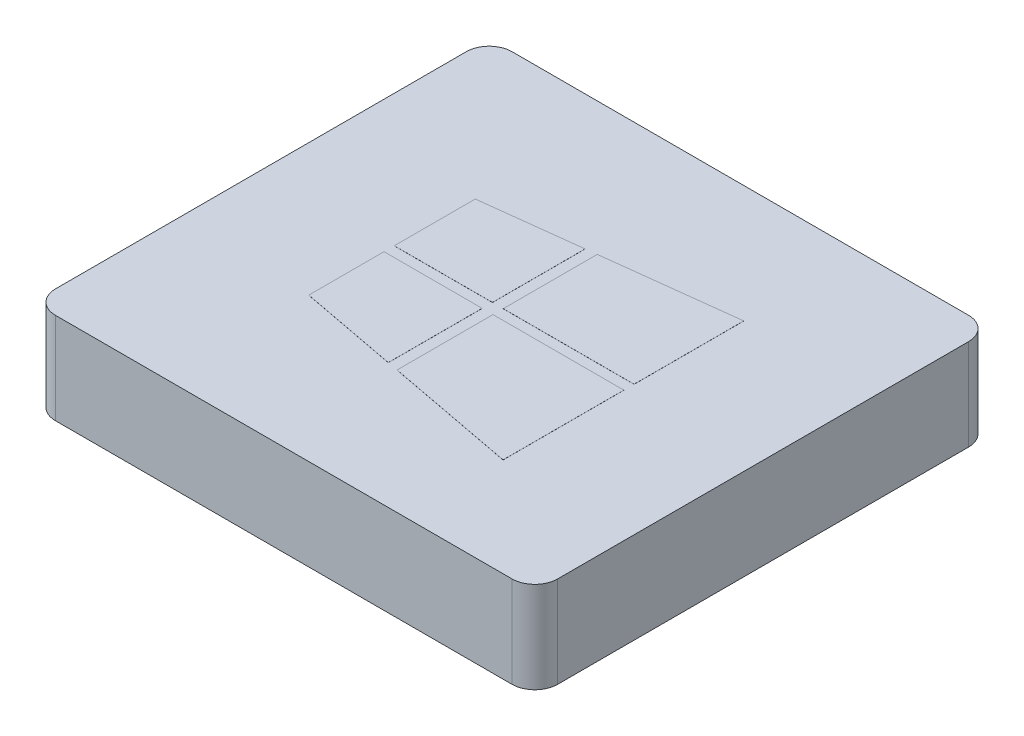
ISO-10303-21;
HEADER;
FILE_DESCRIPTION(('STEP AP214'),'2;1');
FILE_NAME('part.step','',(''),(''),'','','');
FILE_SCHEMA(('AUTOMOTIVE_DESIGN { 1 0 10303 214 1 1 1 1 }'));
ENDSEC;
DATA;
#1=APPLICATION_CONTEXT('core data for automotive mechanical design processes');
#2=APPLICATION_PROTOCOL_DEFINITION('international standard','automotive_design',2000,#1);
#3=PRODUCT_CONTEXT('',#1,'mechanical');
#4=PRODUCT('Part','Part','',(#3));
#5=PRODUCT_RELATED_PRODUCT_CATEGORY('part','',(#4));
#6=PRODUCT_DEFINITION_FORMATION('','',#4);
#7=PRODUCT_DEFINITION_CONTEXT('part definition',#1,'design');
#8=PRODUCT_DEFINITION('design','',#6,#7);
#9=PRODUCT_DEFINITION_SHAPE('','',#8);
#10=(LENGTH_UNIT() NAMED_UNIT(*) SI_UNIT(.MILLI.,.METRE.));
#11=(NAMED_UNIT(*) PLANE_ANGLE_UNIT() SI_UNIT($,.RADIAN.));
#12=(NAMED_UNIT(*) SI_UNIT($,.STERADIAN.) SOLID_ANGLE_UNIT());
#13=UNCERTAINTY_MEASURE_WITH_UNIT(LENGTH_MEASURE(1.E-05),#10,'distance_accuracy_value','');
#14=(GEOMETRIC_REPRESENTATION_CONTEXT(3) GLOBAL_UNCERTAINTY_ASSIGNED_CONTEXT((#13)) GLOBAL_UNIT_ASSIGNED_CONTEXT((#10,
#11,#12)) REPRESENTATION_CONTEXT('',''));
#15=CARTESIAN_POINT('',(0.,0.,0.));
#16=DIRECTION('',(0.,0.,1.));
#17=DIRECTION('',(1.,0.,0.));
#18=AXIS2_PLACEMENT_3D('',#15,#16,#17);
#19=CARTESIAN_POINT('',(0.,2.54,0.));
#20=DIRECTION('',(0.,1.,0.));
#21=DIRECTION('',(0.,0.,1.));
#22=AXIS2_PLACEMENT_3D('',#19,#20,#21);
#23=PLANE('',#22);
#24=DIRECTION('',(-1.,0.,0.));
#25=VECTOR('',#24,1.);
#26=CARTESIAN_POINT('',(13.97,2.54,-12.7));
#27=LINE('',#26,#25);
#28=CARTESIAN_POINT('',(13.335,2.54,-12.7));
#29=VERTEX_POINT('',#28);
#30=CARTESIAN_POINT('',(0.634999999999995,2.54,-12.7));
#31=VERTEX_POINT('',#30);
#32=EDGE_CURVE('E385',#29,#31,#27,.T.);
#33=ORIENTED_EDGE('',*,*,#32,.T.);
#34=CARTESIAN_POINT('',(0.634999999999995,2.54,-12.065));
#35=DIRECTION('',(0.,1.,0.));
#36=DIRECTION('',(0.,0.,1.));
#37=AXIS2_PLACEMENT_3D('',#34,#35,#36);
#38=CIRCLE('',#37,0.635);
#39=CARTESIAN_POINT('',(0.,2.54,-12.065));
#40=VERTEX_POINT('',#39);
#41=EDGE_CURVE('E422',#31,#40,#38,.T.);
#42=ORIENTED_EDGE('',*,*,#41,.T.);
#43=DIRECTION('',(0.,0.,1.));
#44=VECTOR('',#43,1.);
#45=CARTESIAN_POINT('',(0.,2.54,-12.7));
#46=LINE('',#45,#44);
#47=CARTESIAN_POINT('',(0.,2.54,-0.635));
#48=VERTEX_POINT('',#47);
#49=EDGE_CURVE('E375',#40,#48,#46,.T.);
#50=ORIENTED_EDGE('',*,*,#49,.T.);
#51=CARTESIAN_POINT('',(0.635,2.54,-0.635));
#52=DIRECTION('',(0.,1.,0.));
#53=DIRECTION('',(0.,0.,1.));
#54=AXIS2_PLACEMENT_3D('',#51,#52,#53);
#55=CIRCLE('',#54,0.635);
#56=CARTESIAN_POINT('',(0.635,2.54,0.));
#57=VERTEX_POINT('',#56);
#58=EDGE_CURVE('E416',#48,#57,#55,.T.);
#59=ORIENTED_EDGE('',*,*,#58,.T.);
#60=DIRECTION('',(1.,0.,0.));
#61=VECTOR('',#60,1.);
#62=CARTESIAN_POINT('',(0.,2.54,0.));
#63=LINE('',#62,#61);
#64=CARTESIAN_POINT('',(13.335,2.54,0.));
#65=VERTEX_POINT('',#64);
#66=EDGE_CURVE('E378',#57,#65,#63,.T.);
#67=ORIENTED_EDGE('',*,*,#66,.T.);
#68=CARTESIAN_POINT('',(13.335,2.54,-0.635));
#69=DIRECTION('',(0.,1.,0.));
#70=DIRECTION('',(0.,0.,1.));
#71=AXIS2_PLACEMENT_3D('',#68,#69,#70);
#72=CIRCLE('',#71,0.635);
#73=CARTESIAN_POINT('',(13.97,2.54,-0.635));
#74=VERTEX_POINT('',#73);
#75=EDGE_CURVE('E418',#65,#74,#72,.T.);
#76=ORIENTED_EDGE('',*,*,#75,.T.);
#77=DIRECTION('',(0.,0.,-1.));
#78=VECTOR('',#77,1.);
#79=CARTESIAN_POINT('',(13.97,2.54,0.));
#80=LINE('',#79,#78);
#81=CARTESIAN_POINT('',(13.97,2.54,-12.065));
#82=VERTEX_POINT('',#81);
#83=EDGE_CURVE('E382',#74,#82,#80,.T.);
#84=ORIENTED_EDGE('',*,*,#83,.T.);
#85=CARTESIAN_POINT('',(13.335,2.54,-12.065));
#86=DIRECTION('',(0.,1.,0.));
#87=DIRECTION('',(0.,0.,1.));
#88=AXIS2_PLACEMENT_3D('',#85,#86,#87);
#89=CIRCLE('',#88,0.635);
#90=EDGE_CURVE('E420',#82,#29,#89,.T.);
#91=ORIENTED_EDGE('',*,*,#90,.T.);
#92=EDGE_LOOP('',(#33,#42,#50,#59,#67,#76,#84,#91));
#93=FACE_BOUND('',#92,.T.);
#94=DIRECTION('',(1.,0.,0.));
#95=VECTOR('',#94,1.);
#96=CARTESIAN_POINT('',(6.40577196412417,2.54,-6.38504060141719));
#97=LINE('',#96,#95);
#98=CARTESIAN_POINT('',(3.67579997060656,2.54,-6.38504060141719));
#99=VERTEX_POINT('',#98);
#100=CARTESIAN_POINT('',(6.40577196412417,2.54,-6.38504060141719));
#101=VERTEX_POINT('',#100);
#102=EDGE_CURVE('E320',#99,#101,#97,.T.);
#103=ORIENTED_EDGE('',*,*,#102,.F.);
#104=DIRECTION('',(0.,0.,1.));
#105=VECTOR('',#104,1.);
#106=CARTESIAN_POINT('',(3.67579997060656,2.54,-6.38504060141719));
#107=LINE('',#106,#105);
#108=CARTESIAN_POINT('',(3.67579997060656,2.54,-8.6368819068046));
#109=VERTEX_POINT('',#108);
#110=EDGE_CURVE('E306',#109,#99,#107,.T.);
#111=ORIENTED_EDGE('',*,*,#110,.F.);
#112=DIRECTION('',(-0.992924579188595,0.,0.118746705399144));
#113=VECTOR('',#112,1.);
#114=CARTESIAN_POINT('',(3.67579997060656,2.54,-8.6368819068046));
#115=LINE('',#114,#113);
#116=CARTESIAN_POINT('',(6.40577196412417,2.54,-8.96336710704716));
#117=VERTEX_POINT('',#116);
#118=EDGE_CURVE('E311',#117,#109,#115,.T.);
#119=ORIENTED_EDGE('',*,*,#118,.F.);
#120=DIRECTION('',(0.,0.,-1.));
#121=VECTOR('',#120,1.);
#122=CARTESIAN_POINT('',(6.40577196412417,2.54,-8.96336710704716));
#123=LINE('',#122,#121);
#124=EDGE_CURVE('E322',#101,#117,#123,.T.);
#125=ORIENTED_EDGE('',*,*,#124,.F.);
#126=EDGE_LOOP('',(#103,#111,#119,#125));
#127=FACE_BOUND('',#126,.T.);
#128=DIRECTION('',(0.,0.,1.));
#129=VECTOR('',#128,1.);
#130=CARTESIAN_POINT('',(3.67579997060656,2.54,-6.09970454559755));
#131=LINE('',#130,#129);
#132=CARTESIAN_POINT('',(3.67579997060656,2.54,-6.09970454559755));
#133=VERTEX_POINT('',#132);
#134=CARTESIAN_POINT('',(3.67579997060656,2.54,-4.00661172831581));
#135=VERTEX_POINT('',#134);
#136=EDGE_CURVE('E291',#133,#135,#131,.T.);
#137=ORIENTED_EDGE('',*,*,#136,.F.);
#138=DIRECTION('',(-1.,0.,0.));
#139=VECTOR('',#138,1.);
#140=CARTESIAN_POINT('',(6.40577196412417,2.54,-6.09970454559755));
#141=LINE('',#140,#139);
#142=CARTESIAN_POINT('',(6.40577196412417,2.54,-6.09970454559755));
#143=VERTEX_POINT('',#142);
#144=EDGE_CURVE('E277',#143,#133,#141,.T.);
#145=ORIENTED_EDGE('',*,*,#144,.F.);
#146=DIRECTION('',(0.,0.,-1.));
#147=VECTOR('',#146,1.);
#148=CARTESIAN_POINT('',(6.40577196412417,2.54,-3.48850625137088));
#149=LINE('',#148,#147);
#150=CARTESIAN_POINT('',(6.40577196412417,2.54,-3.48850625137088));
#151=VERTEX_POINT('',#150);
#152=EDGE_CURVE('E282',#151,#143,#149,.T.);
#153=ORIENTED_EDGE('',*,*,#152,.F.);
#154=DIRECTION('',(0.982463314673955,0.,0.186455987621384));
#155=VECTOR('',#154,1.);
#156=CARTESIAN_POINT('',(3.67579997060656,2.54,-4.00661172831581));
#157=LINE('',#156,#155);
#158=EDGE_CURVE('E293',#135,#151,#157,.T.);
#159=ORIENTED_EDGE('',*,*,#158,.F.);
#160=EDGE_LOOP('',(#137,#145,#153,#159));
#161=FACE_BOUND('',#160,.T.);
#162=DIRECTION('',(0.,0.,1.));
#163=VECTOR('',#162,1.);
#164=CARTESIAN_POINT('',(6.70653159052866,2.54,-8.99933581554846));
#165=LINE('',#164,#163);
#166=CARTESIAN_POINT('',(6.70653159052866,2.54,-8.99933581554846));
#167=VERTEX_POINT('',#166);
#168=CARTESIAN_POINT('',(6.70653159052866,2.54,-6.38504060141719));
#169=VERTEX_POINT('',#168);
#170=EDGE_CURVE('E249',#167,#169,#165,.T.);
#171=ORIENTED_EDGE('',*,*,#170,.F.);
#172=DIRECTION('',(-0.992924579188595,0.,0.118746705399145));
#173=VECTOR('',#172,1.);
#174=CARTESIAN_POINT('',(10.3458469793895,2.54,-9.43457200709162));
#175=LINE('',#174,#173);
#176=CARTESIAN_POINT('',(10.3458469793895,2.54,-9.43457200709162));
#177=VERTEX_POINT('',#176);
#178=EDGE_CURVE('E246',#177,#167,#175,.T.);
#179=ORIENTED_EDGE('',*,*,#178,.F.);
#180=DIRECTION('',(0.,0.,-1.));
#181=VECTOR('',#180,1.);
#182=CARTESIAN_POINT('',(10.3458469793895,2.54,-6.38504060141719));
#183=LINE('',#182,#181);
#184=CARTESIAN_POINT('',(10.3458469793895,2.54,-6.38504060141719));
#185=VERTEX_POINT('',#184);
#186=EDGE_CURVE('E258',#185,#177,#183,.T.);
#187=ORIENTED_EDGE('',*,*,#186,.F.);
#188=DIRECTION('',(1.,0.,0.));
#189=VECTOR('',#188,1.);
#190=CARTESIAN_POINT('',(6.70653159052866,2.54,-6.38504060141719));
#191=LINE('',#190,#189);
#192=EDGE_CURVE('E266',#169,#185,#191,.T.);
#193=ORIENTED_EDGE('',*,*,#192,.F.);
#194=EDGE_LOOP('',(#171,#179,#187,#193));
#195=FACE_BOUND('',#194,.T.);
#196=DIRECTION('',(0.,0.,1.));
#197=VECTOR('',#196,1.);
#198=CARTESIAN_POINT('',(6.70653159052866,2.54,-6.09970454559755));
#199=LINE('',#198,#197);
#200=CARTESIAN_POINT('',(6.70653159052866,2.54,-6.09970454559755));
#201=VERTEX_POINT('',#200);
#202=CARTESIAN_POINT('',(6.70653159052866,2.54,-3.43142683441932));
#203=VERTEX_POINT('',#202);
#204=EDGE_CURVE('E798',#201,#203,#199,.T.);
#205=ORIENTED_EDGE('',*,*,#204,.F.);
#206=DIRECTION('',(-1.,0.,0.));
#207=VECTOR('',#206,1.);
#208=CARTESIAN_POINT('',(10.3458469793895,2.54,-6.09970454559755));
#209=LINE('',#208,#207);
#210=CARTESIAN_POINT('',(10.3458469793895,2.54,-6.09970454559755));
#211=VERTEX_POINT('',#210);
#212=EDGE_CURVE('E244',#211,#201,#209,.T.);
#213=ORIENTED_EDGE('',*,*,#212,.F.);
#214=DIRECTION('',(0.,0.,-1.));
#215=VECTOR('',#214,1.);
#216=CARTESIAN_POINT('',(10.3458469793895,2.54,-2.74074237326877));
#217=LINE('',#216,#215);
#218=CARTESIAN_POINT('',(10.3458469793895,2.54,-2.74074237326877));
#219=VERTEX_POINT('',#218);
#220=EDGE_CURVE('E240',#219,#211,#217,.T.);
#221=ORIENTED_EDGE('',*,*,#220,.F.);
#222=DIRECTION('',(0.982463314673955,0.,0.186455987621384));
#223=VECTOR('',#222,1.);
#224=CARTESIAN_POINT('',(6.70653159052866,2.54,-3.43142683441932));
#225=LINE('',#224,#223);
#226=EDGE_CURVE('E795',#203,#219,#225,.T.);
#227=ORIENTED_EDGE('',*,*,#226,.F.);
#228=EDGE_LOOP('',(#205,#213,#221,#227));
#229=FACE_BOUND('',#228,.T.);
#230=ADVANCED_FACE('F35',(#93,#127,#161,#195,#229),#23,.T.);
#231=CARTESIAN_POINT('',(0.,2.54,-12.7));
#232=DIRECTION('',(1.,0.,0.));
#233=DIRECTION('',(0.,0.,-1.));
#234=AXIS2_PLACEMENT_3D('',#231,#232,#233);
#235=PLANE('',#234);
#236=ORIENTED_EDGE('',*,*,#49,.F.);
#237=DIRECTION('',(0.,-1.,0.));
#238=VECTOR('',#237,1.);
#239=CARTESIAN_POINT('',(0.,2.54,-12.065));
#240=LINE('',#239,#238);
#241=CARTESIAN_POINT('',(0.,0.,-12.065));
#242=VERTEX_POINT('',#241);
#243=EDGE_CURVE('E400',#40,#242,#240,.T.);
#244=ORIENTED_EDGE('',*,*,#243,.T.);
#245=DIRECTION('',(0.,0.,1.));
#246=VECTOR('',#245,1.);
#247=CARTESIAN_POINT('',(0.,0.,-12.7));
#248=LINE('',#247,#246);
#249=CARTESIAN_POINT('',(0.,0.,-0.635));
#250=VERTEX_POINT('',#249);
#251=EDGE_CURVE('E355',#242,#250,#248,.T.);
#252=ORIENTED_EDGE('',*,*,#251,.T.);
#253=DIRECTION('',(0.,-1.,0.));
#254=VECTOR('',#253,1.);
#255=CARTESIAN_POINT('',(0.,2.54,-0.635));
#256=LINE('',#255,#254);
#257=EDGE_CURVE('E388',#250,#48,#256,.F.);
#258=ORIENTED_EDGE('',*,*,#257,.T.);
#259=EDGE_LOOP('',(#236,#244,#252,#258));
#260=FACE_BOUND('',#259,.T.);
#261=ADVANCED_FACE('F467',(#260),#235,.F.);
#262=CARTESIAN_POINT('',(0.,2.54,0.));
#263=DIRECTION('',(0.,0.,-1.));
#264=DIRECTION('',(-1.,0.,0.));
#265=AXIS2_PLACEMENT_3D('',#262,#263,#264);
#266=PLANE('',#265);
#267=DIRECTION('',(1.,0.,0.));
#268=VECTOR('',#267,1.);
#269=CARTESIAN_POINT('',(0.,0.,0.));
#270=LINE('',#269,#268);
#271=CARTESIAN_POINT('',(0.635,0.,0.));
#272=VERTEX_POINT('',#271);
#273=CARTESIAN_POINT('',(13.335,0.,0.));
#274=VERTEX_POINT('',#273);
#275=EDGE_CURVE('E391',#272,#274,#270,.T.);
#276=ORIENTED_EDGE('',*,*,#275,.T.);
#277=DIRECTION('',(0.,-1.,0.));
#278=VECTOR('',#277,1.);
#279=CARTESIAN_POINT('',(13.335,2.54,0.));
#280=LINE('',#279,#278);
#281=EDGE_CURVE('E43',#274,#65,#280,.F.);
#282=ORIENTED_EDGE('',*,*,#281,.T.);
#283=ORIENTED_EDGE('',*,*,#66,.F.);
#284=DIRECTION('',(0.,-1.,0.));
#285=VECTOR('',#284,1.);
#286=CARTESIAN_POINT('',(0.635,2.54,0.));
#287=LINE('',#286,#285);
#288=EDGE_CURVE('E429',#57,#272,#287,.T.);
#289=ORIENTED_EDGE('',*,*,#288,.T.);
#290=EDGE_LOOP('',(#276,#282,#283,#289));
#291=FACE_BOUND('',#290,.T.);
#292=ADVANCED_FACE('F434',(#291),#266,.F.);
#293=CARTESIAN_POINT('',(13.97,2.54,0.));
#294=DIRECTION('',(-1.,0.,0.));
#295=DIRECTION('',(0.,0.,1.));
#296=AXIS2_PLACEMENT_3D('',#293,#294,#295);
#297=PLANE('',#296);
#298=DIRECTION('',(0.,0.,-1.));
#299=VECTOR('',#298,1.);
#300=CARTESIAN_POINT('',(13.97,0.,0.));
#301=LINE('',#300,#299);
#302=CARTESIAN_POINT('',(13.97,0.,-0.635));
#303=VERTEX_POINT('',#302);
#304=CARTESIAN_POINT('',(13.97,0.,-12.065));
#305=VERTEX_POINT('',#304);
#306=EDGE_CURVE('E394',#303,#305,#301,.T.);
#307=ORIENTED_EDGE('',*,*,#306,.T.);
#308=DIRECTION('',(0.,-1.,0.));
#309=VECTOR('',#308,1.);
#310=CARTESIAN_POINT('',(13.97,2.54,-12.065));
#311=LINE('',#310,#309);
#312=EDGE_CURVE('E427',#305,#82,#311,.F.);
#313=ORIENTED_EDGE('',*,*,#312,.T.);
#314=ORIENTED_EDGE('',*,*,#83,.F.);
#315=DIRECTION('',(0.,-1.,0.));
#316=VECTOR('',#315,1.);
#317=CARTESIAN_POINT('',(13.97,2.54,-0.635));
#318=LINE('',#317,#316);
#319=EDGE_CURVE('E424',#74,#303,#318,.T.);
#320=ORIENTED_EDGE('',*,*,#319,.T.);
#321=EDGE_LOOP('',(#307,#313,#314,#320));
#322=FACE_BOUND('',#321,.T.);
#323=ADVANCED_FACE('F447',(#322),#297,.F.);
#324=CARTESIAN_POINT('',(13.97,2.54,-12.7));
#325=DIRECTION('',(0.,0.,1.));
#326=DIRECTION('',(1.,0.,0.));
#327=AXIS2_PLACEMENT_3D('',#324,#325,#326);
#328=PLANE('',#327);
#329=DIRECTION('',(-1.,0.,0.));
#330=VECTOR('',#329,1.);
#331=CARTESIAN_POINT('',(13.97,0.,-12.7));
#332=LINE('',#331,#330);
#333=CARTESIAN_POINT('',(13.335,0.,-12.7));
#334=VERTEX_POINT('',#333);
#335=CARTESIAN_POINT('',(0.634999999999995,0.,-12.7));
#336=VERTEX_POINT('',#335);
#337=EDGE_CURVE('E379',#334,#336,#332,.T.);
#338=ORIENTED_EDGE('',*,*,#337,.T.);
#339=DIRECTION('',(0.,-1.,0.));
#340=VECTOR('',#339,1.);
#341=CARTESIAN_POINT('',(0.634999999999995,2.54,-12.7));
#342=LINE('',#341,#340);
#343=EDGE_CURVE('E414',#336,#31,#342,.F.);
#344=ORIENTED_EDGE('',*,*,#343,.T.);
#345=ORIENTED_EDGE('',*,*,#32,.F.);
#346=DIRECTION('',(0.,-1.,0.));
#347=VECTOR('',#346,1.);
#348=CARTESIAN_POINT('',(13.335,2.54,-12.7));
#349=LINE('',#348,#347);
#350=EDGE_CURVE('E411',#29,#334,#349,.T.);
#351=ORIENTED_EDGE('',*,*,#350,.T.);
#352=EDGE_LOOP('',(#338,#344,#345,#351));
#353=FACE_BOUND('',#352,.T.);
#354=ADVANCED_FACE('F459',(#353),#328,.F.);
#355=CARTESIAN_POINT('',(0.,0.,0.));
#356=DIRECTION('',(0.,1.,0.));
#357=DIRECTION('',(0.,0.,1.));
#358=AXIS2_PLACEMENT_3D('',#355,#356,#357);
#359=PLANE('',#358);
#360=DIRECTION('',(-1.,0.,0.));
#361=VECTOR('',#360,1.);
#362=CARTESIAN_POINT('',(13.97,0.,-12.065));
#363=LINE('',#362,#361);
#364=CARTESIAN_POINT('',(13.335,0.,-12.065));
#365=VERTEX_POINT('',#364);
#366=CARTESIAN_POINT('',(0.634999999999995,0.,-12.065));
#367=VERTEX_POINT('',#366);
#368=EDGE_CURVE('E343',#365,#367,#363,.T.);
#369=ORIENTED_EDGE('',*,*,#368,.T.);
#370=DIRECTION('',(0.,0.,1.));
#371=VECTOR('',#370,1.);
#372=CARTESIAN_POINT('',(0.634999999999995,0.,-12.7));
#373=LINE('',#372,#371);
#374=CARTESIAN_POINT('',(0.635,0.,-0.635));
#375=VERTEX_POINT('',#374);
#376=EDGE_CURVE('E338',#367,#375,#373,.T.);
#377=ORIENTED_EDGE('',*,*,#376,.T.);
#378=DIRECTION('',(1.,0.,0.));
#379=VECTOR('',#378,1.);
#380=CARTESIAN_POINT('',(0.,0.,-0.635));
#381=LINE('',#380,#379);
#382=CARTESIAN_POINT('',(13.335,0.,-0.635));
#383=VERTEX_POINT('',#382);
#384=EDGE_CURVE('E367',#375,#383,#381,.T.);
#385=ORIENTED_EDGE('',*,*,#384,.T.);
#386=DIRECTION('',(0.,0.,-1.));
#387=VECTOR('',#386,1.);
#388=CARTESIAN_POINT('',(13.335,0.,0.));
#389=LINE('',#388,#387);
#390=EDGE_CURVE('E370',#383,#365,#389,.T.);
#391=ORIENTED_EDGE('',*,*,#390,.T.);
#392=EDGE_LOOP('',(#369,#377,#385,#391));
#393=FACE_BOUND('',#392,.T.);
#394=ORIENTED_EDGE('',*,*,#251,.F.);
#395=CARTESIAN_POINT('',(0.634999999999995,0.,-12.065));
#396=DIRECTION('',(0.,1.,0.));
#397=DIRECTION('',(0.,0.,1.));
#398=AXIS2_PLACEMENT_3D('',#395,#396,#397);
#399=CIRCLE('',#398,0.635);
#400=EDGE_CURVE('E409',#242,#336,#399,.F.);
#401=ORIENTED_EDGE('',*,*,#400,.T.);
#402=ORIENTED_EDGE('',*,*,#337,.F.);
#403=CARTESIAN_POINT('',(13.335,0.,-12.065));
#404=DIRECTION('',(0.,1.,0.));
#405=DIRECTION('',(0.,0.,1.));
#406=AXIS2_PLACEMENT_3D('',#403,#404,#405);
#407=CIRCLE('',#406,0.635);
#408=EDGE_CURVE('E407',#334,#305,#407,.F.);
#409=ORIENTED_EDGE('',*,*,#408,.T.);
#410=ORIENTED_EDGE('',*,*,#306,.F.);
#411=CARTESIAN_POINT('',(13.335,0.,-0.635));
#412=DIRECTION('',(0.,1.,0.));
#413=DIRECTION('',(0.,0.,1.));
#414=AXIS2_PLACEMENT_3D('',#411,#412,#413);
#415=CIRCLE('',#414,0.635);
#416=EDGE_CURVE('E405',#303,#274,#415,.F.);
#417=ORIENTED_EDGE('',*,*,#416,.T.);
#418=ORIENTED_EDGE('',*,*,#275,.F.);
#419=CARTESIAN_POINT('',(0.635,0.,-0.635));
#420=DIRECTION('',(0.,1.,0.));
#421=DIRECTION('',(0.,0.,1.));
#422=AXIS2_PLACEMENT_3D('',#419,#420,#421);
#423=CIRCLE('',#422,0.635);
#424=EDGE_CURVE('E403',#272,#250,#423,.F.);
#425=ORIENTED_EDGE('',*,*,#424,.T.);
#426=EDGE_LOOP('',(#394,#401,#402,#409,#410,#417,#418,#425));
#427=FACE_BOUND('',#426,.T.);
#428=ADVANCED_FACE('F451',(#393,#427),#359,.F.);
#429=CARTESIAN_POINT('',(0.634999999999995,2.54,-12.065));
#430=DIRECTION('',(0.,-1.,0.));
#431=DIRECTION('',(0.,0.,-1.));
#432=AXIS2_PLACEMENT_3D('',#429,#430,#431);
#433=CYLINDRICAL_SURFACE('',#432,0.635);
#434=ORIENTED_EDGE('',*,*,#41,.F.);
#435=ORIENTED_EDGE('',*,*,#343,.F.);
#436=ORIENTED_EDGE('',*,*,#400,.F.);
#437=ORIENTED_EDGE('',*,*,#243,.F.);
#438=EDGE_LOOP('',(#434,#435,#436,#437));
#439=FACE_BOUND('',#438,.T.);
#440=ADVANCED_FACE('F465',(#439),#433,.T.);
#441=CARTESIAN_POINT('',(13.335,2.54,-12.065));
#442=DIRECTION('',(0.,-1.,0.));
#443=DIRECTION('',(0.,0.,-1.));
#444=AXIS2_PLACEMENT_3D('',#441,#442,#443);
#445=CYLINDRICAL_SURFACE('',#444,0.635);
#446=ORIENTED_EDGE('',*,*,#90,.F.);
#447=ORIENTED_EDGE('',*,*,#312,.F.);
#448=ORIENTED_EDGE('',*,*,#408,.F.);
#449=ORIENTED_EDGE('',*,*,#350,.F.);
#450=EDGE_LOOP('',(#446,#447,#448,#449));
#451=FACE_BOUND('',#450,.T.);
#452=ADVANCED_FACE('F456',(#451),#445,.T.);
#453=CARTESIAN_POINT('',(13.335,2.54,-0.635));
#454=DIRECTION('',(0.,-1.,0.));
#455=DIRECTION('',(0.,0.,-1.));
#456=AXIS2_PLACEMENT_3D('',#453,#454,#455);
#457=CYLINDRICAL_SURFACE('',#456,0.635);
#458=ORIENTED_EDGE('',*,*,#75,.F.);
#459=ORIENTED_EDGE('',*,*,#281,.F.);
#460=ORIENTED_EDGE('',*,*,#416,.F.);
#461=ORIENTED_EDGE('',*,*,#319,.F.);
#462=EDGE_LOOP('',(#458,#459,#460,#461));
#463=FACE_BOUND('',#462,.T.);
#464=ADVANCED_FACE('F444',(#463),#457,.T.);
#465=CARTESIAN_POINT('',(0.635,2.54,-0.635));
#466=DIRECTION('',(0.,-1.,0.));
#467=DIRECTION('',(0.,0.,-1.));
#468=AXIS2_PLACEMENT_3D('',#465,#466,#467);
#469=CYLINDRICAL_SURFACE('',#468,0.635);
#470=ORIENTED_EDGE('',*,*,#58,.F.);
#471=ORIENTED_EDGE('',*,*,#257,.F.);
#472=ORIENTED_EDGE('',*,*,#424,.F.);
#473=ORIENTED_EDGE('',*,*,#288,.F.);
#474=EDGE_LOOP('',(#470,#471,#472,#473));
#475=FACE_BOUND('',#474,.T.);
#476=ADVANCED_FACE('F37',(#475),#469,.T.);
#477=CARTESIAN_POINT('',(0.634999999999995,2.54,-12.7));
#478=DIRECTION('',(1.,0.,0.));
#479=DIRECTION('',(0.,0.,-1.));
#480=AXIS2_PLACEMENT_3D('',#477,#478,#479);
#481=PLANE('',#480);
#482=DIRECTION('',(0.,0.,1.));
#483=VECTOR('',#482,1.);
#484=CARTESIAN_POINT('',(0.634999999999995,1.905,-12.7));
#485=LINE('',#484,#483);
#486=CARTESIAN_POINT('',(0.634999999999995,1.905,-12.065));
#487=VERTEX_POINT('',#486);
#488=CARTESIAN_POINT('',(0.635,1.905,-0.635));
#489=VERTEX_POINT('',#488);
#490=EDGE_CURVE('E339',#487,#489,#485,.T.);
#491=ORIENTED_EDGE('',*,*,#490,.T.);
#492=DIRECTION('',(0.,1.,0.));
#493=VECTOR('',#492,1.);
#494=CARTESIAN_POINT('',(0.635,2.54,-0.635));
#495=LINE('',#494,#493);
#496=EDGE_CURVE('E348',#375,#489,#495,.T.);
#497=ORIENTED_EDGE('',*,*,#496,.F.);
#498=ORIENTED_EDGE('',*,*,#376,.F.);
#499=DIRECTION('',(0.,1.,0.));
#500=VECTOR('',#499,1.);
#501=CARTESIAN_POINT('',(0.634999999999995,2.54,-12.065));
#502=LINE('',#501,#500);
#503=EDGE_CURVE('E344',#367,#487,#502,.T.);
#504=ORIENTED_EDGE('',*,*,#503,.T.);
#505=EDGE_LOOP('',(#491,#497,#498,#504));
#506=FACE_BOUND('',#505,.T.);
#507=ADVANCED_FACE('F471',(#506),#481,.T.);
#508=CARTESIAN_POINT('',(0.,2.54,-0.635));
#509=DIRECTION('',(0.,0.,-1.));
#510=DIRECTION('',(-1.,0.,0.));
#511=AXIS2_PLACEMENT_3D('',#508,#509,#510);
#512=PLANE('',#511);
#513=ORIENTED_EDGE('',*,*,#384,.F.);
#514=ORIENTED_EDGE('',*,*,#496,.T.);
#515=DIRECTION('',(1.,0.,0.));
#516=VECTOR('',#515,1.);
#517=CARTESIAN_POINT('',(0.,1.905,-0.635));
#518=LINE('',#517,#516);
#519=CARTESIAN_POINT('',(13.335,1.905,-0.635));
#520=VERTEX_POINT('',#519);
#521=EDGE_CURVE('E342',#489,#520,#518,.T.);
#522=ORIENTED_EDGE('',*,*,#521,.T.);
#523=DIRECTION('',(0.,1.,0.));
#524=VECTOR('',#523,1.);
#525=CARTESIAN_POINT('',(13.335,2.54,-0.635));
#526=LINE('',#525,#524);
#527=EDGE_CURVE('E352',#383,#520,#526,.T.);
#528=ORIENTED_EDGE('',*,*,#527,.F.);
#529=EDGE_LOOP('',(#513,#514,#522,#528));
#530=FACE_BOUND('',#529,.T.);
#531=ADVANCED_FACE('F476',(#530),#512,.T.);
#532=CARTESIAN_POINT('',(13.335,2.54,0.));
#533=DIRECTION('',(-1.,0.,0.));
#534=DIRECTION('',(0.,0.,1.));
#535=AXIS2_PLACEMENT_3D('',#532,#533,#534);
#536=PLANE('',#535);
#537=ORIENTED_EDGE('',*,*,#390,.F.);
#538=ORIENTED_EDGE('',*,*,#527,.T.);
#539=DIRECTION('',(0.,0.,-1.));
#540=VECTOR('',#539,1.);
#541=CARTESIAN_POINT('',(13.335,1.905,0.));
#542=LINE('',#541,#540);
#543=CARTESIAN_POINT('',(13.335,1.905,-12.065));
#544=VERTEX_POINT('',#543);
#545=EDGE_CURVE('E358',#520,#544,#542,.T.);
#546=ORIENTED_EDGE('',*,*,#545,.T.);
#547=DIRECTION('',(0.,1.,0.));
#548=VECTOR('',#547,1.);
#549=CARTESIAN_POINT('',(13.335,2.54,-12.065));
#550=LINE('',#549,#548);
#551=EDGE_CURVE('E347',#365,#544,#550,.T.);
#552=ORIENTED_EDGE('',*,*,#551,.F.);
#553=EDGE_LOOP('',(#537,#538,#546,#552));
#554=FACE_BOUND('',#553,.T.);
#555=ADVANCED_FACE('F538',(#554),#536,.T.);
#556=CARTESIAN_POINT('',(13.97,2.54,-12.065));
#557=DIRECTION('',(0.,0.,1.));
#558=DIRECTION('',(1.,0.,0.));
#559=AXIS2_PLACEMENT_3D('',#556,#557,#558);
#560=PLANE('',#559);
#561=ORIENTED_EDGE('',*,*,#368,.F.);
#562=ORIENTED_EDGE('',*,*,#551,.T.);
#563=DIRECTION('',(-1.,0.,0.));
#564=VECTOR('',#563,1.);
#565=CARTESIAN_POINT('',(13.97,1.905,-12.065));
#566=LINE('',#565,#564);
#567=EDGE_CURVE('E351',#544,#487,#566,.T.);
#568=ORIENTED_EDGE('',*,*,#567,.T.);
#569=ORIENTED_EDGE('',*,*,#503,.F.);
#570=EDGE_LOOP('',(#561,#562,#568,#569));
#571=FACE_BOUND('',#570,.T.);
#572=ADVANCED_FACE('F548',(#571),#560,.T.);
#573=CARTESIAN_POINT('',(0.,1.905,0.));
#574=DIRECTION('',(0.,1.,0.));
#575=DIRECTION('',(0.,0.,1.));
#576=AXIS2_PLACEMENT_3D('',#573,#574,#575);
#577=PLANE('',#576);
#578=CARTESIAN_POINT('',(6.98499999999999,1.905,-6.35));
#579=DIRECTION('',(0.,1.,0.));
#580=DIRECTION('',(0.,0.,1.));
#581=AXIS2_PLACEMENT_3D('',#578,#579,#580);
#582=CIRCLE('',#581,2.54);
#583=CARTESIAN_POINT('',(6.98499999999999,1.905,-3.81));
#584=VERTEX_POINT('',#583);
#585=EDGE_CURVE('E11',#584,#584,#582,.F.);
#586=ORIENTED_EDGE('',*,*,#585,.F.);
#587=EDGE_LOOP('',(#586));
#588=FACE_BOUND('',#587,.T.);
#589=ORIENTED_EDGE('',*,*,#567,.F.);
#590=ORIENTED_EDGE('',*,*,#545,.F.);
#591=ORIENTED_EDGE('',*,*,#521,.F.);
#592=ORIENTED_EDGE('',*,*,#490,.F.);
#593=EDGE_LOOP('',(#589,#590,#591,#592));
#594=FACE_BOUND('',#593,.T.);
#595=ADVANCED_FACE('F489',(#588,#594),#577,.F.);
#596=CARTESIAN_POINT('',(6.98499999999999,-7.18420489685532,-6.35));
#597=DIRECTION('',(0.,1.,0.));
#598=DIRECTION('',(0.,0.,1.));
#599=AXIS2_PLACEMENT_3D('',#596,#597,#598);
#600=CYLINDRICAL_SURFACE('',#599,2.54);
#601=CARTESIAN_POINT('',(6.98499999999999,0.,-6.35));
#602=DIRECTION('',(0.,1.,0.));
#603=DIRECTION('',(0.,0.,1.));
#604=AXIS2_PLACEMENT_3D('',#601,#602,#603);
#605=CIRCLE('',#604,2.54);
#606=CARTESIAN_POINT('',(6.98499999999999,0.,-3.81));
#607=VERTEX_POINT('',#606);
#608=EDGE_CURVE('E335',#607,#607,#605,.T.);
#609=CARTESIAN_POINT('',(6.98499999999999,0.,-3.81));
#610=CARTESIAN_POINT('',(6.98499999999999,0.0198437499999991,-3.81));
#611=CARTESIAN_POINT('',(6.98499999999999,0.0396874999999989,-3.81));
#612=CARTESIAN_POINT('',(6.98499999999999,0.079374999999999,-3.81));
#613=CARTESIAN_POINT('',(6.98499999999999,0.0992187499999992,-3.81));
#614=CARTESIAN_POINT('',(6.98499999999999,0.138906249999999,-3.81));
#615=CARTESIAN_POINT('',(6.98499999999999,0.158749999999999,-3.81));
#616=CARTESIAN_POINT('',(6.98499999999999,0.198437499999999,-3.81));
#617=CARTESIAN_POINT('',(6.98499999999999,0.218281249999999,-3.81));
#618=CARTESIAN_POINT('',(6.98499999999999,0.25796875,-3.81));
#619=CARTESIAN_POINT('',(6.98499999999999,0.277812499999999,-3.81));
#620=CARTESIAN_POINT('',(6.98499999999999,0.317499999999999,-3.81));
#621=CARTESIAN_POINT('',(6.98499999999999,0.337343749999999,-3.81));
#622=CARTESIAN_POINT('',(6.98499999999999,0.377031249999999,-3.81));
#623=CARTESIAN_POINT('',(6.98499999999999,0.396874999999999,-3.81));
#624=CARTESIAN_POINT('',(6.98499999999999,0.436562499999999,-3.81));
#625=CARTESIAN_POINT('',(6.98499999999999,0.456406249999999,-3.81));
#626=CARTESIAN_POINT('',(6.98499999999999,0.496093749999999,-3.81));
#627=CARTESIAN_POINT('',(6.98499999999999,0.515937499999999,-3.81));
#628=CARTESIAN_POINT('',(6.98499999999999,0.555624999999999,-3.81));
#629=CARTESIAN_POINT('',(6.98499999999999,0.575468749999999,-3.81));
#630=CARTESIAN_POINT('',(6.98499999999999,0.615156249999999,-3.81));
#631=CARTESIAN_POINT('',(6.98499999999999,0.634999999999999,-3.81));
#632=CARTESIAN_POINT('',(6.98499999999999,0.674687499999998,-3.81));
#633=CARTESIAN_POINT('',(6.98499999999999,0.694531249999998,-3.81));
#634=CARTESIAN_POINT('',(6.98499999999999,0.734218749999998,-3.81));
#635=CARTESIAN_POINT('',(6.98499999999999,0.754062499999998,-3.81));
#636=CARTESIAN_POINT('',(6.98499999999999,0.793749999999998,-3.81));
#637=CARTESIAN_POINT('',(6.98499999999999,0.813593749999999,-3.81));
#638=CARTESIAN_POINT('',(6.98499999999999,0.853281249999999,-3.81));
#639=CARTESIAN_POINT('',(6.98499999999999,0.873124999999999,-3.81));
#640=CARTESIAN_POINT('',(6.98499999999999,0.912812499999999,-3.81));
#641=CARTESIAN_POINT('',(6.98499999999999,0.932656249999999,-3.81));
#642=CARTESIAN_POINT('',(6.98499999999999,0.972343749999998,-3.81));
#643=CARTESIAN_POINT('',(6.98499999999999,0.992187499999998,-3.81));
#644=CARTESIAN_POINT('',(6.98499999999999,1.031875,-3.81));
#645=CARTESIAN_POINT('',(6.98499999999999,1.05171875,-3.81));
#646=CARTESIAN_POINT('',(6.98499999999999,1.09140625,-3.81));
#647=CARTESIAN_POINT('',(6.98499999999999,1.11125,-3.81));
#648=CARTESIAN_POINT('',(6.98499999999999,1.1509375,-3.81));
#649=CARTESIAN_POINT('',(6.98499999999999,1.17078125,-3.81));
#650=CARTESIAN_POINT('',(6.98499999999999,1.21046875,-3.81));
#651=CARTESIAN_POINT('',(6.98499999999999,1.2303125,-3.81));
#652=CARTESIAN_POINT('',(6.98499999999999,1.27,-3.81));
#653=CARTESIAN_POINT('',(6.98499999999999,1.28984375,-3.81));
#654=CARTESIAN_POINT('',(6.98499999999999,1.32953125,-3.81));
#655=CARTESIAN_POINT('',(6.98499999999999,1.349375,-3.81));
#656=CARTESIAN_POINT('',(6.98499999999999,1.3890625,-3.81));
#657=CARTESIAN_POINT('',(6.98499999999999,1.40890625,-3.81));
#658=CARTESIAN_POINT('',(6.98499999999999,1.44859375,-3.81));
#659=CARTESIAN_POINT('',(6.98499999999999,1.4684375,-3.81));
#660=CARTESIAN_POINT('',(6.98499999999999,1.508125,-3.81));
#661=CARTESIAN_POINT('',(6.98499999999999,1.52796875,-3.81));
#662=CARTESIAN_POINT('',(6.98499999999999,1.56765625,-3.81));
#663=CARTESIAN_POINT('',(6.98499999999999,1.5875,-3.81));
#664=CARTESIAN_POINT('',(6.98499999999999,1.6271875,-3.81));
#665=CARTESIAN_POINT('',(6.98499999999999,1.64703125,-3.81));
#666=CARTESIAN_POINT('',(6.98499999999999,1.68671875,-3.81));
#667=CARTESIAN_POINT('',(6.98499999999999,1.7065625,-3.81));
#668=CARTESIAN_POINT('',(6.98499999999999,1.74625,-3.81));
#669=CARTESIAN_POINT('',(6.98499999999999,1.76609375,-3.81));
#670=CARTESIAN_POINT('',(6.98499999999999,1.80578125,-3.81));
#671=CARTESIAN_POINT('',(6.98499999999999,1.825625,-3.81));
#672=CARTESIAN_POINT('',(6.98499999999999,1.8653125,-3.81));
#673=CARTESIAN_POINT('',(6.98499999999999,1.88515625,-3.81));
#674=CARTESIAN_POINT('',(6.98499999999999,1.905,-3.81));
#675=B_SPLINE_CURVE_WITH_KNOTS('',3,(#609,#610,#611,#612,#613,#614,#615,#616,#617,#618,#619,
#620,#621,#622,#623,#624,#625,#626,#627,#628,#629,#630,#631,#632,#633,#634,#635,#636,#637,#638,
#639,#640,#641,#642,#643,#644,#645,#646,#647,#648,#649,#650,#651,#652,#653,#654,#655,#656,#657,
#658,#659,#660,#661,#662,#663,#664,#665,#666,#667,#668,#669,#670,#671,#672,#673,#674),
.UNSPECIFIED.,.F.,.F.,(4,2,2,2,2,2,2,2,2,2,2,2,2,2,2,2,2,2,2,2,2,2,2,2,2,2,2,2,2,2,2,2,4),(0.,
0.0595312499999997,0.1190625,0.17859375,0.238125,0.29765625,0.3571875,0.41671875,0.47625,
0.53578125,0.5953125,0.654843749999999,0.714374999999999,0.773906249999999,0.8334375,0.89296875,
0.952499999999999,1.01203125,1.0715625,1.13109375,1.190625,1.25015625,1.3096875,1.36921875,
1.42875,1.48828125,1.5478125,1.60734375,1.666875,1.72640625,1.7859375,1.84546875,1.905),.UNSPECIFIED.);
#676=EDGE_CURVE('BSEAM566',#607,#584,#675,.T.);
#677=ORIENTED_EDGE('',*,*,#608,.T.);
#678=ORIENTED_EDGE('',*,*,#585,.T.);
#679=ORIENTED_EDGE('',*,*,#676,.T.);
#680=ORIENTED_EDGE('',*,*,#676,.F.);
#681=EDGE_LOOP('',(#677,#679,#678,#680));
#682=FACE_BOUND('',#681,.T.);
#683=ADVANCED_FACE('F566',(#682),#600,.T.);
#684=CARTESIAN_POINT('',(0.,0.,0.));
#685=DIRECTION('',(0.,1.,0.));
#686=DIRECTION('',(0.,0.,1.));
#687=AXIS2_PLACEMENT_3D('',#684,#685,#686);
#688=PLANE('',#687);
#689=ORIENTED_EDGE('',*,*,#608,.F.);
#690=EDGE_LOOP('',(#689));
#691=FACE_BOUND('',#690,.T.);
#692=ADVANCED_FACE('F574',(#691),#688,.F.);
#693=CARTESIAN_POINT('',(3.67579997060656,2.54254,-6.38504060141719));
#694=DIRECTION('',(1.,0.,0.));
#695=DIRECTION('',(0.,0.,-1.));
#696=AXIS2_PLACEMENT_3D('',#693,#694,#695);
#697=PLANE('',#696);
#698=ORIENTED_EDGE('',*,*,#110,.T.);
#699=DIRECTION('',(0.,-1.,0.));
#700=VECTOR('',#699,1.);
#701=CARTESIAN_POINT('',(3.67579997060656,2.54254,-6.38504060141719));
#702=LINE('',#701,#700);
#703=CARTESIAN_POINT('',(3.67579997060656,2.54254,-6.38504060141719));
#704=VERTEX_POINT('',#703);
#705=EDGE_CURVE('E333',#704,#99,#702,.T.);
#706=ORIENTED_EDGE('',*,*,#705,.F.);
#707=DIRECTION('',(0.,0.,1.));
#708=VECTOR('',#707,1.);
#709=CARTESIAN_POINT('',(3.67579997060656,2.54254,-6.38504060141719));
#710=LINE('',#709,#708);
#711=CARTESIAN_POINT('',(3.67579997060656,2.54254,-8.6368819068046));
#712=VERTEX_POINT('',#711);
#713=EDGE_CURVE('E307',#712,#704,#710,.T.);
#714=ORIENTED_EDGE('',*,*,#713,.F.);
#715=DIRECTION('',(0.,-1.,0.));
#716=VECTOR('',#715,1.);
#717=CARTESIAN_POINT('',(3.67579997060656,2.54254,-8.6368819068046));
#718=LINE('',#717,#716);
#719=EDGE_CURVE('E317',#712,#109,#718,.T.);
#720=ORIENTED_EDGE('',*,*,#719,.T.);
#721=EDGE_LOOP('',(#698,#706,#714,#720));
#722=FACE_BOUND('',#721,.T.);
#723=ADVANCED_FACE('F583',(#722),#697,.F.);
#724=CARTESIAN_POINT('',(6.40577196412417,2.54254,-6.38504060141719));
#725=DIRECTION('',(0.,0.,-1.));
#726=DIRECTION('',(-1.,0.,0.));
#727=AXIS2_PLACEMENT_3D('',#724,#725,#726);
#728=PLANE('',#727);
#729=ORIENTED_EDGE('',*,*,#102,.T.);
#730=DIRECTION('',(0.,-1.,0.));
#731=VECTOR('',#730,1.);
#732=CARTESIAN_POINT('',(6.40577196412417,2.54254,-6.38504060141719));
#733=LINE('',#732,#731);
#734=CARTESIAN_POINT('',(6.40577196412417,2.54254,-6.38504060141719));
#735=VERTEX_POINT('',#734);
#736=EDGE_CURVE('E330',#735,#101,#733,.T.);
#737=ORIENTED_EDGE('',*,*,#736,.F.);
#738=DIRECTION('',(1.,0.,0.));
#739=VECTOR('',#738,1.);
#740=CARTESIAN_POINT('',(6.40577196412417,2.54254,-6.38504060141719));
#741=LINE('',#740,#739);
#742=EDGE_CURVE('E310',#704,#735,#741,.T.);
#743=ORIENTED_EDGE('',*,*,#742,.F.);
#744=ORIENTED_EDGE('',*,*,#705,.T.);
#745=EDGE_LOOP('',(#729,#737,#743,#744));
#746=FACE_BOUND('',#745,.T.);
#747=ADVANCED_FACE('F597',(#746),#728,.F.);
#748=CARTESIAN_POINT('',(6.40577196412417,2.54254,-8.96336710704716));
#749=DIRECTION('',(-1.,0.,0.));
#750=DIRECTION('',(0.,0.,1.));
#751=AXIS2_PLACEMENT_3D('',#748,#749,#750);
#752=PLANE('',#751);
#753=ORIENTED_EDGE('',*,*,#124,.T.);
#754=DIRECTION('',(0.,-1.,0.));
#755=VECTOR('',#754,1.);
#756=CARTESIAN_POINT('',(6.40577196412417,2.54254,-8.96336710704716));
#757=LINE('',#756,#755);
#758=CARTESIAN_POINT('',(6.40577196412417,2.54254,-8.96336710704716));
#759=VERTEX_POINT('',#758);
#760=EDGE_CURVE('E328',#759,#117,#757,.T.);
#761=ORIENTED_EDGE('',*,*,#760,.F.);
#762=DIRECTION('',(0.,0.,-1.));
#763=VECTOR('',#762,1.);
#764=CARTESIAN_POINT('',(6.40577196412417,2.54254,-8.96336710704716));
#765=LINE('',#764,#763);
#766=EDGE_CURVE('E313',#735,#759,#765,.T.);
#767=ORIENTED_EDGE('',*,*,#766,.F.);
#768=ORIENTED_EDGE('',*,*,#736,.T.);
#769=EDGE_LOOP('',(#753,#761,#767,#768));
#770=FACE_BOUND('',#769,.T.);
#771=ADVANCED_FACE('F604',(#770),#752,.F.);
#772=CARTESIAN_POINT('',(3.67579997060656,2.54254,-8.6368819068046));
#773=DIRECTION('',(0.118746705399144,0.,0.992924579188595));
#774=DIRECTION('',(0.992924579188595,0.,-0.118746705399144));
#775=AXIS2_PLACEMENT_3D('',#772,#773,#774);
#776=PLANE('',#775);
#777=ORIENTED_EDGE('',*,*,#118,.T.);
#778=ORIENTED_EDGE('',*,*,#719,.F.);
#779=DIRECTION('',(-0.992924579188595,0.,0.118746705399144));
#780=VECTOR('',#779,1.);
#781=CARTESIAN_POINT('',(3.67579997060656,2.54254,-8.6368819068046));
#782=LINE('',#781,#780);
#783=EDGE_CURVE('E315',#759,#712,#782,.T.);
#784=ORIENTED_EDGE('',*,*,#783,.F.);
#785=ORIENTED_EDGE('',*,*,#760,.T.);
#786=EDGE_LOOP('',(#777,#778,#784,#785));
#787=FACE_BOUND('',#786,.T.);
#788=ADVANCED_FACE('F612',(#787),#776,.F.);
#789=CARTESIAN_POINT('',(0.,2.54254,0.));
#790=DIRECTION('',(0.,1.,0.));
#791=DIRECTION('',(0.,0.,1.));
#792=AXIS2_PLACEMENT_3D('',#789,#790,#791);
#793=PLANE('',#792);
#794=ORIENTED_EDGE('',*,*,#713,.T.);
#795=ORIENTED_EDGE('',*,*,#742,.T.);
#796=ORIENTED_EDGE('',*,*,#766,.T.);
#797=ORIENTED_EDGE('',*,*,#783,.T.);
#798=EDGE_LOOP('',(#794,#795,#796,#797));
#799=FACE_BOUND('',#798,.T.);
#800=ADVANCED_FACE('F620',(#799),#793,.T.);
#801=CARTESIAN_POINT('',(6.40577196412417,2.54254,-6.09970454559755));
#802=DIRECTION('',(0.,0.,1.));
#803=DIRECTION('',(1.,0.,0.));
#804=AXIS2_PLACEMENT_3D('',#801,#802,#803);
#805=PLANE('',#804);
#806=ORIENTED_EDGE('',*,*,#144,.T.);
#807=DIRECTION('',(0.,-1.,0.));
#808=VECTOR('',#807,1.);
#809=CARTESIAN_POINT('',(3.67579997060656,2.54254,-6.09970454559755));
#810=LINE('',#809,#808);
#811=CARTESIAN_POINT('',(3.67579997060656,2.54254,-6.09970454559755));
#812=VERTEX_POINT('',#811);
#813=EDGE_CURVE('E304',#812,#133,#810,.T.);
#814=ORIENTED_EDGE('',*,*,#813,.F.);
#815=DIRECTION('',(-1.,0.,0.));
#816=VECTOR('',#815,1.);
#817=CARTESIAN_POINT('',(6.40577196412417,2.54254,-6.09970454559755));
#818=LINE('',#817,#816);
#819=CARTESIAN_POINT('',(6.40577196412417,2.54254,-6.09970454559755));
#820=VERTEX_POINT('',#819);
#821=EDGE_CURVE('E278',#820,#812,#818,.T.);
#822=ORIENTED_EDGE('',*,*,#821,.F.);
#823=DIRECTION('',(0.,-1.,0.));
#824=VECTOR('',#823,1.);
#825=CARTESIAN_POINT('',(6.40577196412417,2.54254,-6.09970454559755));
#826=LINE('',#825,#824);
#827=EDGE_CURVE('E288',#820,#143,#826,.T.);
#828=ORIENTED_EDGE('',*,*,#827,.T.);
#829=EDGE_LOOP('',(#806,#814,#822,#828));
#830=FACE_BOUND('',#829,.T.);
#831=ADVANCED_FACE('F629',(#830),#805,.F.);
#832=CARTESIAN_POINT('',(3.67579997060656,2.54254,-6.09970454559755));
#833=DIRECTION('',(1.,0.,0.));
#834=DIRECTION('',(0.,0.,-1.));
#835=AXIS2_PLACEMENT_3D('',#832,#833,#834);
#836=PLANE('',#835);
#837=ORIENTED_EDGE('',*,*,#136,.T.);
#838=DIRECTION('',(0.,-1.,0.));
#839=VECTOR('',#838,1.);
#840=CARTESIAN_POINT('',(3.67579997060656,2.54254,-4.00661172831581));
#841=LINE('',#840,#839);
#842=CARTESIAN_POINT('',(3.67579997060656,2.54254,-4.00661172831581));
#843=VERTEX_POINT('',#842);
#844=EDGE_CURVE('E301',#843,#135,#841,.T.);
#845=ORIENTED_EDGE('',*,*,#844,.F.);
#846=DIRECTION('',(0.,0.,1.));
#847=VECTOR('',#846,1.);
#848=CARTESIAN_POINT('',(3.67579997060656,2.54254,-6.09970454559755));
#849=LINE('',#848,#847);
#850=EDGE_CURVE('E281',#812,#843,#849,.T.);
#851=ORIENTED_EDGE('',*,*,#850,.F.);
#852=ORIENTED_EDGE('',*,*,#813,.T.);
#853=EDGE_LOOP('',(#837,#845,#851,#852));
#854=FACE_BOUND('',#853,.T.);
#855=ADVANCED_FACE('F638',(#854),#836,.F.);
#856=CARTESIAN_POINT('',(3.67579997060656,2.54254,-4.00661172831581));
#857=DIRECTION('',(0.186455987621384,0.,-0.982463314673955));
#858=DIRECTION('',(-0.982463314673955,0.,-0.186455987621384));
#859=AXIS2_PLACEMENT_3D('',#856,#857,#858);
#860=PLANE('',#859);
#861=ORIENTED_EDGE('',*,*,#158,.T.);
#862=DIRECTION('',(0.,-1.,0.));
#863=VECTOR('',#862,1.);
#864=CARTESIAN_POINT('',(6.40577196412417,2.54254,-3.48850625137088));
#865=LINE('',#864,#863);
#866=CARTESIAN_POINT('',(6.40577196412417,2.54254,-3.48850625137088));
#867=VERTEX_POINT('',#866);
#868=EDGE_CURVE('E299',#867,#151,#865,.T.);
#869=ORIENTED_EDGE('',*,*,#868,.F.);
#870=DIRECTION('',(0.982463314673955,0.,0.186455987621384));
#871=VECTOR('',#870,1.);
#872=CARTESIAN_POINT('',(3.67579997060656,2.54254,-4.00661172831581));
#873=LINE('',#872,#871);
#874=EDGE_CURVE('E284',#843,#867,#873,.T.);
#875=ORIENTED_EDGE('',*,*,#874,.F.);
#876=ORIENTED_EDGE('',*,*,#844,.T.);
#877=EDGE_LOOP('',(#861,#869,#875,#876));
#878=FACE_BOUND('',#877,.T.);
#879=ADVANCED_FACE('F646',(#878),#860,.F.);
#880=CARTESIAN_POINT('',(6.40577196412417,2.54254,-3.48850625137088));
#881=DIRECTION('',(-1.,0.,0.));
#882=DIRECTION('',(0.,0.,1.));
#883=AXIS2_PLACEMENT_3D('',#880,#881,#882);
#884=PLANE('',#883);
#885=ORIENTED_EDGE('',*,*,#152,.T.);
#886=ORIENTED_EDGE('',*,*,#827,.F.);
#887=DIRECTION('',(0.,0.,-1.));
#888=VECTOR('',#887,1.);
#889=CARTESIAN_POINT('',(6.40577196412417,2.54254,-3.48850625137088));
#890=LINE('',#889,#888);
#891=EDGE_CURVE('E286',#867,#820,#890,.T.);
#892=ORIENTED_EDGE('',*,*,#891,.F.);
#893=ORIENTED_EDGE('',*,*,#868,.T.);
#894=EDGE_LOOP('',(#885,#886,#892,#893));
#895=FACE_BOUND('',#894,.T.);
#896=ADVANCED_FACE('F654',(#895),#884,.F.);
#897=CARTESIAN_POINT('',(0.,2.54254,0.));
#898=DIRECTION('',(0.,1.,0.));
#899=DIRECTION('',(0.,0.,1.));
#900=AXIS2_PLACEMENT_3D('',#897,#898,#899);
#901=PLANE('',#900);
#902=ORIENTED_EDGE('',*,*,#821,.T.);
#903=ORIENTED_EDGE('',*,*,#850,.T.);
#904=ORIENTED_EDGE('',*,*,#874,.T.);
#905=ORIENTED_EDGE('',*,*,#891,.T.);
#906=EDGE_LOOP('',(#902,#903,#904,#905));
#907=FACE_BOUND('',#906,.T.);
#908=ADVANCED_FACE('F662',(#907),#901,.T.);
#909=CARTESIAN_POINT('',(10.3458469793895,2.54254,-9.43457200709162));
#910=DIRECTION('',(0.118746705399145,0.,0.992924579188595));
#911=DIRECTION('',(0.992924579188595,0.,-0.118746705399145));
#912=AXIS2_PLACEMENT_3D('',#909,#910,#911);
#913=PLANE('',#912);
#914=ORIENTED_EDGE('',*,*,#178,.T.);
#915=DIRECTION('',(0.,-1.,0.));
#916=VECTOR('',#915,1.);
#917=CARTESIAN_POINT('',(6.70653159052866,2.54254,-8.99933581554846));
#918=LINE('',#917,#916);
#919=CARTESIAN_POINT('',(6.70653159052866,2.54254,-8.99933581554846));
#920=VERTEX_POINT('',#919);
#921=EDGE_CURVE('E275',#920,#167,#918,.T.);
#922=ORIENTED_EDGE('',*,*,#921,.F.);
#923=DIRECTION('',(-0.992924579188595,0.,0.118746705399145));
#924=VECTOR('',#923,1.);
#925=CARTESIAN_POINT('',(10.3458469793895,2.54254,-9.43457200709162));
#926=LINE('',#925,#924);
#927=CARTESIAN_POINT('',(10.3458469793895,2.54254,-9.43457200709162));
#928=VERTEX_POINT('',#927);
#929=EDGE_CURVE('E254',#928,#920,#926,.T.);
#930=ORIENTED_EDGE('',*,*,#929,.F.);
#931=DIRECTION('',(0.,-1.,0.));
#932=VECTOR('',#931,1.);
#933=CARTESIAN_POINT('',(10.3458469793895,2.54254,-9.43457200709162));
#934=LINE('',#933,#932);
#935=EDGE_CURVE('E263',#928,#177,#934,.T.);
#936=ORIENTED_EDGE('',*,*,#935,.T.);
#937=EDGE_LOOP('',(#914,#922,#930,#936));
#938=FACE_BOUND('',#937,.T.);
#939=ADVANCED_FACE('F670',(#938),#913,.F.);
#940=CARTESIAN_POINT('',(6.70653159052866,2.54254,-8.99933581554846));
#941=DIRECTION('',(1.,0.,0.));
#942=DIRECTION('',(0.,0.,-1.));
#943=AXIS2_PLACEMENT_3D('',#940,#941,#942);
#944=PLANE('',#943);
#945=ORIENTED_EDGE('',*,*,#170,.T.);
#946=DIRECTION('',(0.,-1.,0.));
#947=VECTOR('',#946,1.);
#948=CARTESIAN_POINT('',(6.70653159052866,2.54254,-6.38504060141719));
#949=LINE('',#948,#947);
#950=CARTESIAN_POINT('',(6.70653159052866,2.54254,-6.38504060141719));
#951=VERTEX_POINT('',#950);
#952=EDGE_CURVE('E272',#951,#169,#949,.T.);
#953=ORIENTED_EDGE('',*,*,#952,.F.);
#954=DIRECTION('',(0.,0.,1.));
#955=VECTOR('',#954,1.);
#956=CARTESIAN_POINT('',(6.70653159052866,2.54254,-8.99933581554846));
#957=LINE('',#956,#955);
#958=EDGE_CURVE('E257',#920,#951,#957,.T.);
#959=ORIENTED_EDGE('',*,*,#958,.F.);
#960=ORIENTED_EDGE('',*,*,#921,.T.);
#961=EDGE_LOOP('',(#945,#953,#959,#960));
#962=FACE_BOUND('',#961,.T.);
#963=ADVANCED_FACE('F678',(#962),#944,.F.);
#964=CARTESIAN_POINT('',(6.70653159052866,2.54254,-6.38504060141719));
#965=DIRECTION('',(0.,0.,-1.));
#966=DIRECTION('',(-1.,0.,0.));
#967=AXIS2_PLACEMENT_3D('',#964,#965,#966);
#968=PLANE('',#967);
#969=ORIENTED_EDGE('',*,*,#192,.T.);
#970=DIRECTION('',(0.,-1.,0.));
#971=VECTOR('',#970,1.);
#972=CARTESIAN_POINT('',(10.3458469793895,2.54254,-6.38504060141719));
#973=LINE('',#972,#971);
#974=CARTESIAN_POINT('',(10.3458469793895,2.54254,-6.38504060141719));
#975=VERTEX_POINT('',#974);
#976=EDGE_CURVE('E58',#975,#185,#973,.T.);
#977=ORIENTED_EDGE('',*,*,#976,.F.);
#978=DIRECTION('',(1.,0.,0.));
#979=VECTOR('',#978,1.);
#980=CARTESIAN_POINT('',(6.70653159052866,2.54254,-6.38504060141719));
#981=LINE('',#980,#979);
#982=EDGE_CURVE('E260',#951,#975,#981,.T.);
#983=ORIENTED_EDGE('',*,*,#982,.F.);
#984=ORIENTED_EDGE('',*,*,#952,.T.);
#985=EDGE_LOOP('',(#969,#977,#983,#984));
#986=FACE_BOUND('',#985,.T.);
#987=ADVANCED_FACE('F686',(#986),#968,.F.);
#988=CARTESIAN_POINT('',(10.3458469793895,2.54254,-6.38504060141719));
#989=DIRECTION('',(-1.,0.,0.));
#990=DIRECTION('',(0.,0.,1.));
#991=AXIS2_PLACEMENT_3D('',#988,#989,#990);
#992=PLANE('',#991);
#993=ORIENTED_EDGE('',*,*,#186,.T.);
#994=ORIENTED_EDGE('',*,*,#935,.F.);
#995=DIRECTION('',(0.,0.,-1.));
#996=VECTOR('',#995,1.);
#997=CARTESIAN_POINT('',(10.3458469793895,2.54254,-6.38504060141719));
#998=LINE('',#997,#996);
#999=EDGE_CURVE('E262',#975,#928,#998,.T.);
#1000=ORIENTED_EDGE('',*,*,#999,.F.);
#1001=ORIENTED_EDGE('',*,*,#976,.T.);
#1002=EDGE_LOOP('',(#993,#994,#1000,#1001));
#1003=FACE_BOUND('',#1002,.T.);
#1004=ADVANCED_FACE('F694',(#1003),#992,.F.);
#1005=CARTESIAN_POINT('',(0.,2.54254,0.));
#1006=DIRECTION('',(0.,1.,0.));
#1007=DIRECTION('',(0.,0.,1.));
#1008=AXIS2_PLACEMENT_3D('',#1005,#1006,#1007);
#1009=PLANE('',#1008);
#1010=ORIENTED_EDGE('',*,*,#929,.T.);
#1011=ORIENTED_EDGE('',*,*,#958,.T.);
#1012=ORIENTED_EDGE('',*,*,#982,.T.);
#1013=ORIENTED_EDGE('',*,*,#999,.T.);
#1014=EDGE_LOOP('',(#1010,#1011,#1012,#1013));
#1015=FACE_BOUND('',#1014,.T.);
#1016=ADVANCED_FACE('F702',(#1015),#1009,.T.);
#1017=CARTESIAN_POINT('',(10.3458469793895,2.54254,-6.09970454559755));
#1018=DIRECTION('',(0.,0.,1.));
#1019=DIRECTION('',(1.,0.,0.));
#1020=AXIS2_PLACEMENT_3D('',#1017,#1018,#1019);
#1021=PLANE('',#1020);
#1022=ORIENTED_EDGE('',*,*,#212,.T.);
#1023=DIRECTION('',(0.,-1.,0.));
#1024=VECTOR('',#1023,1.);
#1025=CARTESIAN_POINT('',(6.70653159052866,2.54254,-6.09970454559755));
#1026=LINE('',#1025,#1024);
#1027=CARTESIAN_POINT('',(6.70653159052866,2.54254,-6.09970454559755));
#1028=VERTEX_POINT('',#1027);
#1029=EDGE_CURVE('E225',#1028,#201,#1026,.T.);
#1030=ORIENTED_EDGE('',*,*,#1029,.F.);
#1031=DIRECTION('',(-1.,0.,0.));
#1032=VECTOR('',#1031,1.);
#1033=CARTESIAN_POINT('',(10.3458469793895,2.54254,-6.09970454559755));
#1034=LINE('',#1033,#1032);
#1035=CARTESIAN_POINT('',(10.3458469793895,2.54254,-6.09970454559755));
#1036=VERTEX_POINT('',#1035);
#1037=EDGE_CURVE('E232',#1036,#1028,#1034,.T.);
#1038=ORIENTED_EDGE('',*,*,#1037,.F.);
#1039=DIRECTION('',(0.,-1.,0.));
#1040=VECTOR('',#1039,1.);
#1041=CARTESIAN_POINT('',(10.3458469793895,2.54254,-6.09970454559755));
#1042=LINE('',#1041,#1040);
#1043=EDGE_CURVE('E792',#1036,#211,#1042,.T.);
#1044=ORIENTED_EDGE('',*,*,#1043,.T.);
#1045=EDGE_LOOP('',(#1022,#1030,#1038,#1044));
#1046=FACE_BOUND('',#1045,.T.);
#1047=ADVANCED_FACE('F242',(#1046),#1021,.F.);
#1048=CARTESIAN_POINT('',(6.70653159052866,2.54254,-6.09970454559755));
#1049=DIRECTION('',(1.,0.,0.));
#1050=DIRECTION('',(0.,0.,-1.));
#1051=AXIS2_PLACEMENT_3D('',#1048,#1049,#1050);
#1052=PLANE('',#1051);
#1053=ORIENTED_EDGE('',*,*,#204,.T.);
#1054=DIRECTION('',(0.,-1.,0.));
#1055=VECTOR('',#1054,1.);
#1056=CARTESIAN_POINT('',(6.70653159052866,2.54254,-3.43142683441932));
#1057=LINE('',#1056,#1055);
#1058=CARTESIAN_POINT('',(6.70653159052866,2.54254,-3.43142683441932));
#1059=VERTEX_POINT('',#1058);
#1060=EDGE_CURVE('E228',#1059,#203,#1057,.T.);
#1061=ORIENTED_EDGE('',*,*,#1060,.F.);
#1062=DIRECTION('',(0.,0.,1.));
#1063=VECTOR('',#1062,1.);
#1064=CARTESIAN_POINT('',(6.70653159052866,2.54254,-6.09970454559755));
#1065=LINE('',#1064,#1063);
#1066=EDGE_CURVE('E221',#1028,#1059,#1065,.T.);
#1067=ORIENTED_EDGE('',*,*,#1066,.F.);
#1068=ORIENTED_EDGE('',*,*,#1029,.T.);
#1069=EDGE_LOOP('',(#1053,#1061,#1067,#1068));
#1070=FACE_BOUND('',#1069,.T.);
#1071=ADVANCED_FACE('F223',(#1070),#1052,.F.);
#1072=CARTESIAN_POINT('',(6.70653159052866,2.54254,-3.43142683441932));
#1073=DIRECTION('',(0.186455987621384,0.,-0.982463314673955));
#1074=DIRECTION('',(-0.982463314673955,0.,-0.186455987621384));
#1075=AXIS2_PLACEMENT_3D('',#1072,#1073,#1074);
#1076=PLANE('',#1075);
#1077=ORIENTED_EDGE('',*,*,#226,.T.);
#1078=DIRECTION('',(0.,-1.,0.));
#1079=VECTOR('',#1078,1.);
#1080=CARTESIAN_POINT('',(10.3458469793895,2.54254,-2.74074237326877));
#1081=LINE('',#1080,#1079);
#1082=CARTESIAN_POINT('',(10.3458469793895,2.54254,-2.74074237326877));
#1083=VERTEX_POINT('',#1082);
#1084=EDGE_CURVE('E50',#1083,#219,#1081,.T.);
#1085=ORIENTED_EDGE('',*,*,#1084,.F.);
#1086=DIRECTION('',(0.982463314673955,0.,0.186455987621384));
#1087=VECTOR('',#1086,1.);
#1088=CARTESIAN_POINT('',(6.70653159052866,2.54254,-3.43142683441932));
#1089=LINE('',#1088,#1087);
#1090=EDGE_CURVE('E231',#1059,#1083,#1089,.T.);
#1091=ORIENTED_EDGE('',*,*,#1090,.F.);
#1092=ORIENTED_EDGE('',*,*,#1060,.T.);
#1093=EDGE_LOOP('',(#1077,#1085,#1091,#1092));
#1094=FACE_BOUND('',#1093,.T.);
#1095=ADVANCED_FACE('F721',(#1094),#1076,.F.);
#1096=CARTESIAN_POINT('',(10.3458469793895,2.54254,-2.74074237326877));
#1097=DIRECTION('',(-1.,0.,0.));
#1098=DIRECTION('',(0.,0.,1.));
#1099=AXIS2_PLACEMENT_3D('',#1096,#1097,#1098);
#1100=PLANE('',#1099);
#1101=ORIENTED_EDGE('',*,*,#220,.T.);
#1102=ORIENTED_EDGE('',*,*,#1043,.F.);
#1103=DIRECTION('',(0.,0.,-1.));
#1104=VECTOR('',#1103,1.);
#1105=CARTESIAN_POINT('',(10.3458469793895,2.54254,-2.74074237326877));
#1106=LINE('',#1105,#1104);
#1107=EDGE_CURVE('E236',#1083,#1036,#1106,.T.);
#1108=ORIENTED_EDGE('',*,*,#1107,.F.);
#1109=ORIENTED_EDGE('',*,*,#1084,.T.);
#1110=EDGE_LOOP('',(#1101,#1102,#1108,#1109));
#1111=FACE_BOUND('',#1110,.T.);
#1112=ADVANCED_FACE('F728',(#1111),#1100,.F.);
#1113=CARTESIAN_POINT('',(0.,2.54254,0.));
#1114=DIRECTION('',(0.,1.,0.));
#1115=DIRECTION('',(0.,0.,1.));
#1116=AXIS2_PLACEMENT_3D('',#1113,#1114,#1115);
#1117=PLANE('',#1116);
#1118=ORIENTED_EDGE('',*,*,#1037,.T.);
#1119=ORIENTED_EDGE('',*,*,#1066,.T.);
#1120=ORIENTED_EDGE('',*,*,#1090,.T.);
#1121=ORIENTED_EDGE('',*,*,#1107,.T.);
#1122=EDGE_LOOP('',(#1118,#1119,#1120,#1121));
#1123=FACE_BOUND('',#1122,.T.);
#1124=ADVANCED_FACE('F235',(#1123),#1117,.T.);
#1125=CLOSED_SHELL('',(#230,#261,#292,#323,#354,#428,#440,#452,#464,#476,#507,#531,#555,#572,
#595,#683,#692,#723,#747,#771,#788,#800,#831,#855,#879,#896,#908,#939,#963,#987,#1004,#1016,
#1047,#1071,#1095,#1112,#1124));
#1126=MANIFOLD_SOLID_BREP('B2',#1125);
#1127=ADVANCED_BREP_SHAPE_REPRESENTATION('',(#18,#1126),#14);
#1128=SHAPE_DEFINITION_REPRESENTATION(#9,#1127);
ENDSEC;
END-ISO-10303-21;
